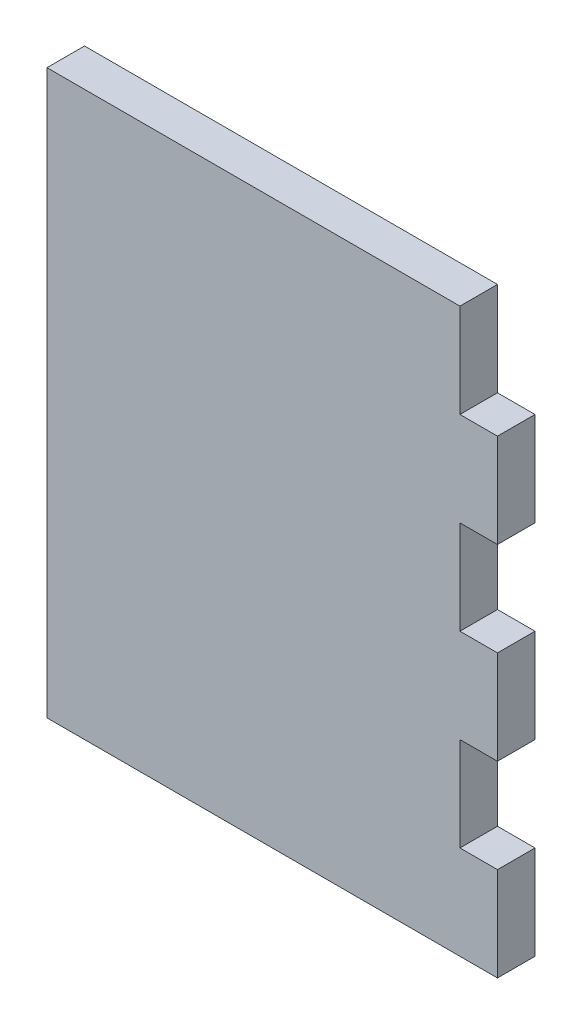
ISO-10303-21;
HEADER;
FILE_DESCRIPTION(('STEP AP214'),'2;1');
FILE_NAME('part.step','',(''),(''),'','','');
FILE_SCHEMA(('AUTOMOTIVE_DESIGN { 1 0 10303 214 1 1 1 1 }'));
ENDSEC;
DATA;
#1=APPLICATION_CONTEXT('core data for automotive mechanical design processes');
#2=APPLICATION_PROTOCOL_DEFINITION('international standard','automotive_design',2000,#1);
#3=PRODUCT_CONTEXT('',#1,'mechanical');
#4=PRODUCT('Part','Part','',(#3));
#5=PRODUCT_RELATED_PRODUCT_CATEGORY('part','',(#4));
#6=PRODUCT_DEFINITION_FORMATION('','',#4);
#7=PRODUCT_DEFINITION_CONTEXT('part definition',#1,'design');
#8=PRODUCT_DEFINITION('design','',#6,#7);
#9=PRODUCT_DEFINITION_SHAPE('','',#8);
#10=(LENGTH_UNIT() NAMED_UNIT(*) SI_UNIT(.MILLI.,.METRE.));
#11=(NAMED_UNIT(*) PLANE_ANGLE_UNIT() SI_UNIT($,.RADIAN.));
#12=(NAMED_UNIT(*) SI_UNIT($,.STERADIAN.) SOLID_ANGLE_UNIT());
#13=UNCERTAINTY_MEASURE_WITH_UNIT(LENGTH_MEASURE(1.E-05),#10,'distance_accuracy_value','');
#14=(GEOMETRIC_REPRESENTATION_CONTEXT(3) GLOBAL_UNCERTAINTY_ASSIGNED_CONTEXT((#13)) GLOBAL_UNIT_ASSIGNED_CONTEXT((#10,
#11,#12)) REPRESENTATION_CONTEXT('',''));
#15=CARTESIAN_POINT('',(0.,0.,0.));
#16=DIRECTION('',(0.,0.,1.));
#17=DIRECTION('',(1.,0.,0.));
#18=AXIS2_PLACEMENT_3D('',#15,#16,#17);
#19=CARTESIAN_POINT('',(0.,75.,5.));
#20=DIRECTION('',(1.,0.,0.));
#21=DIRECTION('',(0.,0.,-1.));
#22=AXIS2_PLACEMENT_3D('',#19,#20,#21);
#23=PLANE('',#22);
#24=DIRECTION('',(0.,-1.,0.));
#25=VECTOR('',#24,1.);
#26=CARTESIAN_POINT('',(0.,75.,0.));
#27=LINE('',#26,#25);
#28=CARTESIAN_POINT('',(0.,75.,0.));
#29=VERTEX_POINT('',#28);
#30=CARTESIAN_POINT('',(0.,0.,0.));
#31=VERTEX_POINT('',#30);
#32=EDGE_CURVE('E167',#29,#31,#27,.T.);
#33=ORIENTED_EDGE('',*,*,#32,.T.);
#34=DIRECTION('',(0.,0.,-1.));
#35=VECTOR('',#34,1.);
#36=CARTESIAN_POINT('',(0.,0.,5.));
#37=LINE('',#36,#35);
#38=CARTESIAN_POINT('',(0.,0.,5.));
#39=VERTEX_POINT('',#38);
#40=EDGE_CURVE('E11',#39,#31,#37,.T.);
#41=ORIENTED_EDGE('',*,*,#40,.F.);
#42=DIRECTION('',(0.,-1.,0.));
#43=VECTOR('',#42,1.);
#44=CARTESIAN_POINT('',(0.,75.,5.));
#45=LINE('',#44,#43);
#46=CARTESIAN_POINT('',(0.,75.,5.));
#47=VERTEX_POINT('',#46);
#48=EDGE_CURVE('E193',#47,#39,#45,.T.);
#49=ORIENTED_EDGE('',*,*,#48,.F.);
#50=DIRECTION('',(0.,0.,-1.));
#51=VECTOR('',#50,1.);
#52=CARTESIAN_POINT('',(0.,75.,5.));
#53=LINE('',#52,#51);
#54=EDGE_CURVE('E163',#47,#29,#53,.T.);
#55=ORIENTED_EDGE('',*,*,#54,.T.);
#56=EDGE_LOOP('',(#33,#41,#49,#55));
#57=FACE_BOUND('',#56,.T.);
#58=ADVANCED_FACE('F35',(#57),#23,.F.);
#59=CARTESIAN_POINT('',(0.,0.,5.));
#60=DIRECTION('',(0.,1.,0.));
#61=DIRECTION('',(0.,0.,1.));
#62=AXIS2_PLACEMENT_3D('',#59,#60,#61);
#63=PLANE('',#62);
#64=DIRECTION('',(1.,0.,0.));
#65=VECTOR('',#64,1.);
#66=CARTESIAN_POINT('',(0.,0.,0.));
#67=LINE('',#66,#65);
#68=CARTESIAN_POINT('',(60.,0.,0.));
#69=VERTEX_POINT('',#68);
#70=EDGE_CURVE('E170',#31,#69,#67,.T.);
#71=ORIENTED_EDGE('',*,*,#70,.T.);
#72=DIRECTION('',(0.,0.,-1.));
#73=VECTOR('',#72,1.);
#74=CARTESIAN_POINT('',(60.,0.,5.));
#75=LINE('',#74,#73);
#76=CARTESIAN_POINT('',(60.,0.,5.));
#77=VERTEX_POINT('',#76);
#78=EDGE_CURVE('E43',#77,#69,#75,.T.);
#79=ORIENTED_EDGE('',*,*,#78,.F.);
#80=DIRECTION('',(1.,0.,0.));
#81=VECTOR('',#80,1.);
#82=CARTESIAN_POINT('',(0.,0.,5.));
#83=LINE('',#82,#81);
#84=EDGE_CURVE('E112',#39,#77,#83,.T.);
#85=ORIENTED_EDGE('',*,*,#84,.F.);
#86=ORIENTED_EDGE('',*,*,#40,.T.);
#87=EDGE_LOOP('',(#71,#79,#85,#86));
#88=FACE_BOUND('',#87,.T.);
#89=ADVANCED_FACE('F281',(#88),#63,.F.);
#90=CARTESIAN_POINT('',(60.,0.,5.));
#91=DIRECTION('',(-1.,0.,0.));
#92=DIRECTION('',(0.,0.,1.));
#93=AXIS2_PLACEMENT_3D('',#90,#91,#92);
#94=PLANE('',#93);
#95=DIRECTION('',(0.,1.,0.));
#96=VECTOR('',#95,1.);
#97=CARTESIAN_POINT('',(60.,0.,0.));
#98=LINE('',#97,#96);
#99=CARTESIAN_POINT('',(60.,12.5,0.));
#100=VERTEX_POINT('',#99);
#101=EDGE_CURVE('E172',#69,#100,#98,.T.);
#102=ORIENTED_EDGE('',*,*,#101,.T.);
#103=DIRECTION('',(0.,0.,-1.));
#104=VECTOR('',#103,1.);
#105=CARTESIAN_POINT('',(60.,12.5,5.));
#106=LINE('',#105,#104);
#107=CARTESIAN_POINT('',(60.,12.5,5.));
#108=VERTEX_POINT('',#107);
#109=EDGE_CURVE('E218',#108,#100,#106,.T.);
#110=ORIENTED_EDGE('',*,*,#109,.F.);
#111=DIRECTION('',(0.,1.,0.));
#112=VECTOR('',#111,1.);
#113=CARTESIAN_POINT('',(60.,0.,5.));
#114=LINE('',#113,#112);
#115=EDGE_CURVE('E226',#77,#108,#114,.T.);
#116=ORIENTED_EDGE('',*,*,#115,.F.);
#117=ORIENTED_EDGE('',*,*,#78,.T.);
#118=EDGE_LOOP('',(#102,#110,#116,#117));
#119=FACE_BOUND('',#118,.T.);
#120=ADVANCED_FACE('F224',(#119),#94,.F.);
#121=CARTESIAN_POINT('',(60.,12.5,5.));
#122=DIRECTION('',(0.,-1.,0.));
#123=DIRECTION('',(1.,0.,0.));
#124=AXIS2_PLACEMENT_3D('',#121,#122,#123);
#125=PLANE('',#124);
#126=DIRECTION('',(-1.,0.,0.));
#127=VECTOR('',#126,1.);
#128=CARTESIAN_POINT('',(60.,12.5,0.));
#129=LINE('',#128,#127);
#130=CARTESIAN_POINT('',(55.,12.5,0.));
#131=VERTEX_POINT('',#130);
#132=EDGE_CURVE('E174',#100,#131,#129,.T.);
#133=ORIENTED_EDGE('',*,*,#132,.T.);
#134=DIRECTION('',(0.,0.,-1.));
#135=VECTOR('',#134,1.);
#136=CARTESIAN_POINT('',(55.,12.5,5.));
#137=LINE('',#136,#135);
#138=CARTESIAN_POINT('',(55.,12.5,5.));
#139=VERTEX_POINT('',#138);
#140=EDGE_CURVE('E215',#139,#131,#137,.T.);
#141=ORIENTED_EDGE('',*,*,#140,.F.);
#142=DIRECTION('',(-1.,0.,0.));
#143=VECTOR('',#142,1.);
#144=CARTESIAN_POINT('',(60.,12.5,5.));
#145=LINE('',#144,#143);
#146=EDGE_CURVE('E244',#108,#139,#145,.T.);
#147=ORIENTED_EDGE('',*,*,#146,.F.);
#148=ORIENTED_EDGE('',*,*,#109,.T.);
#149=EDGE_LOOP('',(#133,#141,#147,#148));
#150=FACE_BOUND('',#149,.T.);
#151=ADVANCED_FACE('F235',(#150),#125,.F.);
#152=CARTESIAN_POINT('',(55.,12.5,5.));
#153=DIRECTION('',(-1.,0.,0.));
#154=DIRECTION('',(0.,0.,1.));
#155=AXIS2_PLACEMENT_3D('',#152,#153,#154);
#156=PLANE('',#155);
#157=DIRECTION('',(0.,1.,0.));
#158=VECTOR('',#157,1.);
#159=CARTESIAN_POINT('',(55.,12.5,0.));
#160=LINE('',#159,#158);
#161=CARTESIAN_POINT('',(55.,25.,0.));
#162=VERTEX_POINT('',#161);
#163=EDGE_CURVE('E176',#131,#162,#160,.T.);
#164=ORIENTED_EDGE('',*,*,#163,.T.);
#165=DIRECTION('',(0.,0.,-1.));
#166=VECTOR('',#165,1.);
#167=CARTESIAN_POINT('',(55.,25.,5.));
#168=LINE('',#167,#166);
#169=CARTESIAN_POINT('',(55.,25.,5.));
#170=VERTEX_POINT('',#169);
#171=EDGE_CURVE('E212',#170,#162,#168,.T.);
#172=ORIENTED_EDGE('',*,*,#171,.F.);
#173=DIRECTION('',(0.,1.,0.));
#174=VECTOR('',#173,1.);
#175=CARTESIAN_POINT('',(55.,12.5,5.));
#176=LINE('',#175,#174);
#177=EDGE_CURVE('E241',#139,#170,#176,.T.);
#178=ORIENTED_EDGE('',*,*,#177,.F.);
#179=ORIENTED_EDGE('',*,*,#140,.T.);
#180=EDGE_LOOP('',(#164,#172,#178,#179));
#181=FACE_BOUND('',#180,.T.);
#182=ADVANCED_FACE('F239',(#181),#156,.F.);
#183=CARTESIAN_POINT('',(55.,25.,5.));
#184=DIRECTION('',(0.,1.,0.));
#185=DIRECTION('',(-1.,0.,0.));
#186=AXIS2_PLACEMENT_3D('',#183,#184,#185);
#187=PLANE('',#186);
#188=DIRECTION('',(1.,0.,0.));
#189=VECTOR('',#188,1.);
#190=CARTESIAN_POINT('',(55.,25.,0.));
#191=LINE('',#190,#189);
#192=CARTESIAN_POINT('',(60.,25.,0.));
#193=VERTEX_POINT('',#192);
#194=EDGE_CURVE('E178',#162,#193,#191,.T.);
#195=ORIENTED_EDGE('',*,*,#194,.T.);
#196=DIRECTION('',(0.,0.,-1.));
#197=VECTOR('',#196,1.);
#198=CARTESIAN_POINT('',(60.,25.,5.));
#199=LINE('',#198,#197);
#200=CARTESIAN_POINT('',(60.,25.,5.));
#201=VERTEX_POINT('',#200);
#202=EDGE_CURVE('E209',#201,#193,#199,.T.);
#203=ORIENTED_EDGE('',*,*,#202,.F.);
#204=DIRECTION('',(1.,0.,0.));
#205=VECTOR('',#204,1.);
#206=CARTESIAN_POINT('',(55.,25.,5.));
#207=LINE('',#206,#205);
#208=EDGE_CURVE('E243',#170,#201,#207,.T.);
#209=ORIENTED_EDGE('',*,*,#208,.F.);
#210=ORIENTED_EDGE('',*,*,#171,.T.);
#211=EDGE_LOOP('',(#195,#203,#209,#210));
#212=FACE_BOUND('',#211,.T.);
#213=ADVANCED_FACE('F294',(#212),#187,.F.);
#214=CARTESIAN_POINT('',(60.,25.,5.));
#215=DIRECTION('',(-1.,0.,0.));
#216=DIRECTION('',(0.,0.,1.));
#217=AXIS2_PLACEMENT_3D('',#214,#215,#216);
#218=PLANE('',#217);
#219=DIRECTION('',(0.,1.,0.));
#220=VECTOR('',#219,1.);
#221=CARTESIAN_POINT('',(60.,25.,0.));
#222=LINE('',#221,#220);
#223=CARTESIAN_POINT('',(60.,37.5,0.));
#224=VERTEX_POINT('',#223);
#225=EDGE_CURVE('E180',#193,#224,#222,.T.);
#226=ORIENTED_EDGE('',*,*,#225,.T.);
#227=DIRECTION('',(0.,0.,-1.));
#228=VECTOR('',#227,1.);
#229=CARTESIAN_POINT('',(60.,37.5,5.));
#230=LINE('',#229,#228);
#231=CARTESIAN_POINT('',(60.,37.5,5.));
#232=VERTEX_POINT('',#231);
#233=EDGE_CURVE('E206',#232,#224,#230,.T.);
#234=ORIENTED_EDGE('',*,*,#233,.F.);
#235=DIRECTION('',(0.,1.,0.));
#236=VECTOR('',#235,1.);
#237=CARTESIAN_POINT('',(60.,25.,5.));
#238=LINE('',#237,#236);
#239=EDGE_CURVE('E246',#201,#232,#238,.T.);
#240=ORIENTED_EDGE('',*,*,#239,.F.);
#241=ORIENTED_EDGE('',*,*,#202,.T.);
#242=EDGE_LOOP('',(#226,#234,#240,#241));
#243=FACE_BOUND('',#242,.T.);
#244=ADVANCED_FACE('F297',(#243),#218,.F.);
#245=CARTESIAN_POINT('',(60.,37.5,5.));
#246=DIRECTION('',(0.,-1.,0.));
#247=DIRECTION('',(1.,0.,0.));
#248=AXIS2_PLACEMENT_3D('',#245,#246,#247);
#249=PLANE('',#248);
#250=DIRECTION('',(-1.,0.,0.));
#251=VECTOR('',#250,1.);
#252=CARTESIAN_POINT('',(60.,37.5,0.));
#253=LINE('',#252,#251);
#254=CARTESIAN_POINT('',(55.,37.5,0.));
#255=VERTEX_POINT('',#254);
#256=EDGE_CURVE('E182',#224,#255,#253,.T.);
#257=ORIENTED_EDGE('',*,*,#256,.T.);
#258=DIRECTION('',(0.,0.,-1.));
#259=VECTOR('',#258,1.);
#260=CARTESIAN_POINT('',(55.,37.5,5.));
#261=LINE('',#260,#259);
#262=CARTESIAN_POINT('',(55.,37.5,5.));
#263=VERTEX_POINT('',#262);
#264=EDGE_CURVE('E203',#263,#255,#261,.T.);
#265=ORIENTED_EDGE('',*,*,#264,.F.);
#266=DIRECTION('',(-1.,0.,0.));
#267=VECTOR('',#266,1.);
#268=CARTESIAN_POINT('',(60.,37.5,5.));
#269=LINE('',#268,#267);
#270=EDGE_CURVE('E252',#232,#263,#269,.T.);
#271=ORIENTED_EDGE('',*,*,#270,.F.);
#272=ORIENTED_EDGE('',*,*,#233,.T.);
#273=EDGE_LOOP('',(#257,#265,#271,#272));
#274=FACE_BOUND('',#273,.T.);
#275=ADVANCED_FACE('F301',(#274),#249,.F.);
#276=CARTESIAN_POINT('',(55.,37.5,5.));
#277=DIRECTION('',(-1.,0.,0.));
#278=DIRECTION('',(0.,0.,1.));
#279=AXIS2_PLACEMENT_3D('',#276,#277,#278);
#280=PLANE('',#279);
#281=DIRECTION('',(0.,1.,0.));
#282=VECTOR('',#281,1.);
#283=CARTESIAN_POINT('',(55.,37.5,0.));
#284=LINE('',#283,#282);
#285=CARTESIAN_POINT('',(55.,50.,0.));
#286=VERTEX_POINT('',#285);
#287=EDGE_CURVE('E184',#255,#286,#284,.T.);
#288=ORIENTED_EDGE('',*,*,#287,.T.);
#289=DIRECTION('',(0.,0.,-1.));
#290=VECTOR('',#289,1.);
#291=CARTESIAN_POINT('',(55.,50.,5.));
#292=LINE('',#291,#290);
#293=CARTESIAN_POINT('',(55.,50.,5.));
#294=VERTEX_POINT('',#293);
#295=EDGE_CURVE('E200',#294,#286,#292,.T.);
#296=ORIENTED_EDGE('',*,*,#295,.F.);
#297=DIRECTION('',(0.,1.,0.));
#298=VECTOR('',#297,1.);
#299=CARTESIAN_POINT('',(55.,37.5,5.));
#300=LINE('',#299,#298);
#301=EDGE_CURVE('E254',#263,#294,#300,.T.);
#302=ORIENTED_EDGE('',*,*,#301,.F.);
#303=ORIENTED_EDGE('',*,*,#264,.T.);
#304=EDGE_LOOP('',(#288,#296,#302,#303));
#305=FACE_BOUND('',#304,.T.);
#306=ADVANCED_FACE('F305',(#305),#280,.F.);
#307=CARTESIAN_POINT('',(55.,50.,5.));
#308=DIRECTION('',(0.,1.,0.));
#309=DIRECTION('',(-1.,0.,0.));
#310=AXIS2_PLACEMENT_3D('',#307,#308,#309);
#311=PLANE('',#310);
#312=DIRECTION('',(1.,0.,0.));
#313=VECTOR('',#312,1.);
#314=CARTESIAN_POINT('',(55.,50.,0.));
#315=LINE('',#314,#313);
#316=CARTESIAN_POINT('',(60.,50.,0.));
#317=VERTEX_POINT('',#316);
#318=EDGE_CURVE('E186',#286,#317,#315,.T.);
#319=ORIENTED_EDGE('',*,*,#318,.T.);
#320=DIRECTION('',(0.,0.,-1.));
#321=VECTOR('',#320,1.);
#322=CARTESIAN_POINT('',(60.,50.,5.));
#323=LINE('',#322,#321);
#324=CARTESIAN_POINT('',(60.,50.,5.));
#325=VERTEX_POINT('',#324);
#326=EDGE_CURVE('E197',#325,#317,#323,.T.);
#327=ORIENTED_EDGE('',*,*,#326,.F.);
#328=DIRECTION('',(1.,0.,0.));
#329=VECTOR('',#328,1.);
#330=CARTESIAN_POINT('',(55.,50.,5.));
#331=LINE('',#330,#329);
#332=EDGE_CURVE('E256',#294,#325,#331,.T.);
#333=ORIENTED_EDGE('',*,*,#332,.F.);
#334=ORIENTED_EDGE('',*,*,#295,.T.);
#335=EDGE_LOOP('',(#319,#327,#333,#334));
#336=FACE_BOUND('',#335,.T.);
#337=ADVANCED_FACE('F262',(#336),#311,.F.);
#338=CARTESIAN_POINT('',(60.,50.,5.));
#339=DIRECTION('',(-1.,0.,0.));
#340=DIRECTION('',(0.,0.,1.));
#341=AXIS2_PLACEMENT_3D('',#338,#339,#340);
#342=PLANE('',#341);
#343=DIRECTION('',(0.,1.,0.));
#344=VECTOR('',#343,1.);
#345=CARTESIAN_POINT('',(60.,50.,0.));
#346=LINE('',#345,#344);
#347=CARTESIAN_POINT('',(60.,62.5,0.));
#348=VERTEX_POINT('',#347);
#349=EDGE_CURVE('E188',#317,#348,#346,.T.);
#350=ORIENTED_EDGE('',*,*,#349,.T.);
#351=DIRECTION('',(0.,0.,-1.));
#352=VECTOR('',#351,1.);
#353=CARTESIAN_POINT('',(60.,62.5,5.));
#354=LINE('',#353,#352);
#355=CARTESIAN_POINT('',(60.,62.5,5.));
#356=VERTEX_POINT('',#355);
#357=EDGE_CURVE('E158',#356,#348,#354,.T.);
#358=ORIENTED_EDGE('',*,*,#357,.F.);
#359=DIRECTION('',(0.,1.,0.));
#360=VECTOR('',#359,1.);
#361=CARTESIAN_POINT('',(60.,50.,5.));
#362=LINE('',#361,#360);
#363=EDGE_CURVE('E149',#325,#356,#362,.T.);
#364=ORIENTED_EDGE('',*,*,#363,.F.);
#365=ORIENTED_EDGE('',*,*,#326,.T.);
#366=EDGE_LOOP('',(#350,#358,#364,#365));
#367=FACE_BOUND('',#366,.T.);
#368=ADVANCED_FACE('F266',(#367),#342,.F.);
#369=CARTESIAN_POINT('',(60.,62.5,5.));
#370=DIRECTION('',(0.,-1.,0.));
#371=DIRECTION('',(1.,0.,0.));
#372=AXIS2_PLACEMENT_3D('',#369,#370,#371);
#373=PLANE('',#372);
#374=DIRECTION('',(-1.,0.,0.));
#375=VECTOR('',#374,1.);
#376=CARTESIAN_POINT('',(60.,62.5,0.));
#377=LINE('',#376,#375);
#378=CARTESIAN_POINT('',(55.,62.5,0.));
#379=VERTEX_POINT('',#378);
#380=EDGE_CURVE('E157',#348,#379,#377,.T.);
#381=ORIENTED_EDGE('',*,*,#380,.T.);
#382=DIRECTION('',(0.,0.,-1.));
#383=VECTOR('',#382,1.);
#384=CARTESIAN_POINT('',(55.,62.5,5.));
#385=LINE('',#384,#383);
#386=CARTESIAN_POINT('',(55.,62.5,5.));
#387=VERTEX_POINT('',#386);
#388=EDGE_CURVE('E154',#387,#379,#385,.T.);
#389=ORIENTED_EDGE('',*,*,#388,.F.);
#390=DIRECTION('',(-1.,0.,0.));
#391=VECTOR('',#390,1.);
#392=CARTESIAN_POINT('',(60.,62.5,5.));
#393=LINE('',#392,#391);
#394=EDGE_CURVE('E143',#356,#387,#393,.T.);
#395=ORIENTED_EDGE('',*,*,#394,.F.);
#396=ORIENTED_EDGE('',*,*,#357,.T.);
#397=EDGE_LOOP('',(#381,#389,#395,#396));
#398=FACE_BOUND('',#397,.T.);
#399=ADVANCED_FACE('F155',(#398),#373,.F.);
#400=CARTESIAN_POINT('',(55.,62.5,5.));
#401=DIRECTION('',(-1.,0.,0.));
#402=DIRECTION('',(0.,0.,1.));
#403=AXIS2_PLACEMENT_3D('',#400,#401,#402);
#404=PLANE('',#403);
#405=DIRECTION('',(0.,1.,0.));
#406=VECTOR('',#405,1.);
#407=CARTESIAN_POINT('',(55.,62.5,0.));
#408=LINE('',#407,#406);
#409=CARTESIAN_POINT('',(55.,75.,0.));
#410=VERTEX_POINT('',#409);
#411=EDGE_CURVE('E98',#379,#410,#408,.T.);
#412=ORIENTED_EDGE('',*,*,#411,.T.);
#413=DIRECTION('',(0.,0.,-1.));
#414=VECTOR('',#413,1.);
#415=CARTESIAN_POINT('',(55.,75.,5.));
#416=LINE('',#415,#414);
#417=CARTESIAN_POINT('',(55.,75.,5.));
#418=VERTEX_POINT('',#417);
#419=EDGE_CURVE('E159',#418,#410,#416,.T.);
#420=ORIENTED_EDGE('',*,*,#419,.F.);
#421=DIRECTION('',(0.,1.,0.));
#422=VECTOR('',#421,1.);
#423=CARTESIAN_POINT('',(55.,62.5,5.));
#424=LINE('',#423,#422);
#425=EDGE_CURVE('E147',#387,#418,#424,.T.);
#426=ORIENTED_EDGE('',*,*,#425,.F.);
#427=ORIENTED_EDGE('',*,*,#388,.T.);
#428=EDGE_LOOP('',(#412,#420,#426,#427));
#429=FACE_BOUND('',#428,.T.);
#430=ADVANCED_FACE('F161',(#429),#404,.F.);
#431=CARTESIAN_POINT('',(55.,75.,5.));
#432=DIRECTION('',(0.,-1.,0.));
#433=DIRECTION('',(0.,0.,-1.));
#434=AXIS2_PLACEMENT_3D('',#431,#432,#433);
#435=PLANE('',#434);
#436=DIRECTION('',(-1.,0.,0.));
#437=VECTOR('',#436,1.);
#438=CARTESIAN_POINT('',(55.,75.,0.));
#439=LINE('',#438,#437);
#440=EDGE_CURVE('E104',#410,#29,#439,.T.);
#441=ORIENTED_EDGE('',*,*,#440,.T.);
#442=ORIENTED_EDGE('',*,*,#54,.F.);
#443=DIRECTION('',(-1.,0.,0.));
#444=VECTOR('',#443,1.);
#445=CARTESIAN_POINT('',(55.,75.,5.));
#446=LINE('',#445,#444);
#447=EDGE_CURVE('E51',#418,#47,#446,.T.);
#448=ORIENTED_EDGE('',*,*,#447,.F.);
#449=ORIENTED_EDGE('',*,*,#419,.T.);
#450=EDGE_LOOP('',(#441,#442,#448,#449));
#451=FACE_BOUND('',#450,.T.);
#452=ADVANCED_FACE('F270',(#451),#435,.F.);
#453=CARTESIAN_POINT('',(0.,0.,5.));
#454=DIRECTION('',(0.,0.,1.));
#455=DIRECTION('',(1.,0.,0.));
#456=AXIS2_PLACEMENT_3D('',#453,#454,#455);
#457=PLANE('',#456);
#458=ORIENTED_EDGE('',*,*,#48,.T.);
#459=ORIENTED_EDGE('',*,*,#84,.T.);
#460=ORIENTED_EDGE('',*,*,#115,.T.);
#461=ORIENTED_EDGE('',*,*,#146,.T.);
#462=ORIENTED_EDGE('',*,*,#177,.T.);
#463=ORIENTED_EDGE('',*,*,#208,.T.);
#464=ORIENTED_EDGE('',*,*,#239,.T.);
#465=ORIENTED_EDGE('',*,*,#270,.T.);
#466=ORIENTED_EDGE('',*,*,#301,.T.);
#467=ORIENTED_EDGE('',*,*,#332,.T.);
#468=ORIENTED_EDGE('',*,*,#363,.T.);
#469=ORIENTED_EDGE('',*,*,#394,.T.);
#470=ORIENTED_EDGE('',*,*,#425,.T.);
#471=ORIENTED_EDGE('',*,*,#447,.T.);
#472=EDGE_LOOP('',(#458,#459,#460,#461,#462,#463,#464,#465,#466,#467,#468,#469,#470,#471));
#473=FACE_BOUND('',#472,.T.);
#474=ADVANCED_FACE('F145',(#473),#457,.T.);
#475=CARTESIAN_POINT('',(0.,0.,0.));
#476=DIRECTION('',(0.,0.,1.));
#477=DIRECTION('',(1.,0.,0.));
#478=AXIS2_PLACEMENT_3D('',#475,#476,#477);
#479=PLANE('',#478);
#480=ORIENTED_EDGE('',*,*,#32,.F.);
#481=ORIENTED_EDGE('',*,*,#440,.F.);
#482=ORIENTED_EDGE('',*,*,#411,.F.);
#483=ORIENTED_EDGE('',*,*,#380,.F.);
#484=ORIENTED_EDGE('',*,*,#349,.F.);
#485=ORIENTED_EDGE('',*,*,#318,.F.);
#486=ORIENTED_EDGE('',*,*,#287,.F.);
#487=ORIENTED_EDGE('',*,*,#256,.F.);
#488=ORIENTED_EDGE('',*,*,#225,.F.);
#489=ORIENTED_EDGE('',*,*,#194,.F.);
#490=ORIENTED_EDGE('',*,*,#163,.F.);
#491=ORIENTED_EDGE('',*,*,#132,.F.);
#492=ORIENTED_EDGE('',*,*,#101,.F.);
#493=ORIENTED_EDGE('',*,*,#70,.F.);
#494=EDGE_LOOP('',(#480,#481,#482,#483,#484,#485,#486,#487,#488,#489,#490,#491,#492,#493));
#495=FACE_BOUND('',#494,.T.);
#496=ADVANCED_FACE('F230',(#495),#479,.F.);
#497=CLOSED_SHELL('',(#58,#89,#120,#151,#182,#213,#244,#275,#306,#337,#368,#399,#430,#452,#474,#496));
#498=MANIFOLD_SOLID_BREP('B2',#497);
#499=ADVANCED_BREP_SHAPE_REPRESENTATION('',(#18,#498),#14);
#500=SHAPE_DEFINITION_REPRESENTATION(#9,#499);
ENDSEC;
END-ISO-10303-21;
